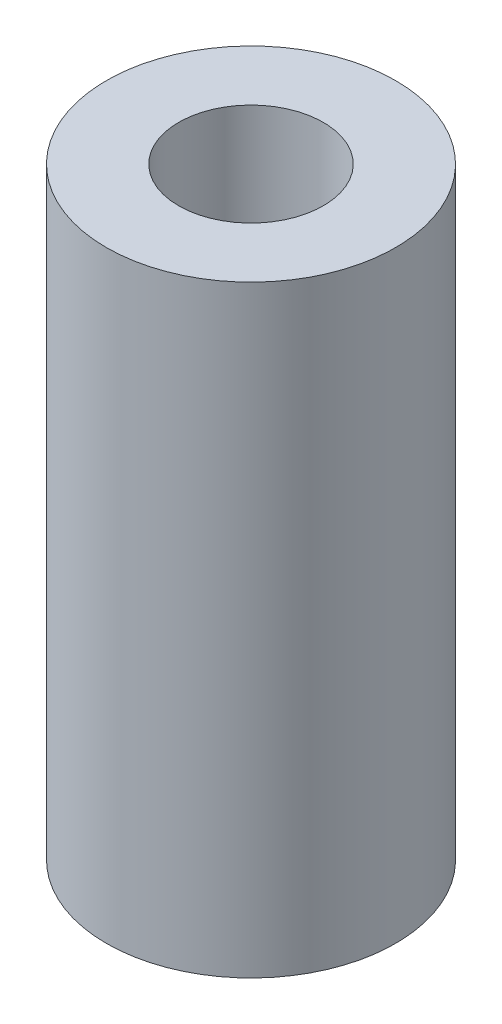
ISO-10303-21;
HEADER;
FILE_DESCRIPTION(('STEP AP214'),'2;1');
FILE_NAME('part.step','',(''),(''),'','','');
FILE_SCHEMA(('AUTOMOTIVE_DESIGN { 1 0 10303 214 1 1 1 1 }'));
ENDSEC;
DATA;
#1=APPLICATION_CONTEXT('core data for automotive mechanical design processes');
#2=APPLICATION_PROTOCOL_DEFINITION('international standard','automotive_design',2000,#1);
#3=PRODUCT_CONTEXT('',#1,'mechanical');
#4=PRODUCT('Part','Part','',(#3));
#5=PRODUCT_RELATED_PRODUCT_CATEGORY('part','',(#4));
#6=PRODUCT_DEFINITION_FORMATION('','',#4);
#7=PRODUCT_DEFINITION_CONTEXT('part definition',#1,'design');
#8=PRODUCT_DEFINITION('design','',#6,#7);
#9=PRODUCT_DEFINITION_SHAPE('','',#8);
#10=(LENGTH_UNIT() NAMED_UNIT(*) SI_UNIT(.MILLI.,.METRE.));
#11=(NAMED_UNIT(*) PLANE_ANGLE_UNIT() SI_UNIT($,.RADIAN.));
#12=(NAMED_UNIT(*) SI_UNIT($,.STERADIAN.) SOLID_ANGLE_UNIT());
#13=UNCERTAINTY_MEASURE_WITH_UNIT(LENGTH_MEASURE(1.E-05),#10,'distance_accuracy_value','');
#14=(GEOMETRIC_REPRESENTATION_CONTEXT(3) GLOBAL_UNCERTAINTY_ASSIGNED_CONTEXT((#13)) GLOBAL_UNIT_ASSIGNED_CONTEXT((#10,
#11,#12)) REPRESENTATION_CONTEXT('',''));
#15=CARTESIAN_POINT('',(0.,0.,0.));
#16=DIRECTION('',(0.,0.,1.));
#17=DIRECTION('',(1.,0.,0.));
#18=AXIS2_PLACEMENT_3D('',#15,#16,#17);
#19=CARTESIAN_POINT('',(0.,25.,0.));
#20=DIRECTION('',(0.,1.,0.));
#21=DIRECTION('',(0.,0.,1.));
#22=AXIS2_PLACEMENT_3D('',#19,#20,#21);
#23=PLANE('',#22);
#24=CARTESIAN_POINT('',(0.,25.,0.));
#25=DIRECTION('',(0.,1.,0.));
#26=DIRECTION('',(0.,0.,1.));
#27=AXIS2_PLACEMENT_3D('',#24,#25,#26);
#28=CIRCLE('',#27,6.);
#29=CARTESIAN_POINT('',(0.,25.,6.));
#30=VERTEX_POINT('',#29);
#31=EDGE_CURVE('E10',#30,#30,#28,.T.);
#32=ORIENTED_EDGE('',*,*,#31,.T.);
#33=EDGE_LOOP('',(#32));
#34=FACE_BOUND('',#33,.T.);
#35=CARTESIAN_POINT('',(0.,25.,0.));
#36=DIRECTION('',(0.,1.,0.));
#37=DIRECTION('',(0.,0.,1.));
#38=AXIS2_PLACEMENT_3D('',#35,#36,#37);
#39=CIRCLE('',#38,3.);
#40=CARTESIAN_POINT('',(0.,25.,3.));
#41=VERTEX_POINT('',#40);
#42=EDGE_CURVE('E52',#41,#41,#39,.T.);
#43=ORIENTED_EDGE('',*,*,#42,.F.);
#44=EDGE_LOOP('',(#43));
#45=FACE_BOUND('',#44,.T.);
#46=ADVANCED_FACE('F39',(#34,#45),#23,.T.);
#47=CARTESIAN_POINT('',(0.,0.,0.));
#48=DIRECTION('',(0.,1.,0.));
#49=DIRECTION('',(0.,0.,1.));
#50=AXIS2_PLACEMENT_3D('',#47,#48,#49);
#51=PLANE('',#50);
#52=CARTESIAN_POINT('',(0.,0.,0.));
#53=DIRECTION('',(0.,1.,0.));
#54=DIRECTION('',(0.,0.,1.));
#55=AXIS2_PLACEMENT_3D('',#52,#53,#54);
#56=CIRCLE('',#55,6.);
#57=CARTESIAN_POINT('',(0.,0.,6.));
#58=VERTEX_POINT('',#57);
#59=EDGE_CURVE('E43',#58,#58,#56,.T.);
#60=ORIENTED_EDGE('',*,*,#59,.F.);
#61=EDGE_LOOP('',(#60));
#62=FACE_BOUND('',#61,.T.);
#63=CARTESIAN_POINT('',(0.,0.,0.));
#64=DIRECTION('',(0.,1.,0.));
#65=DIRECTION('',(0.,0.,1.));
#66=AXIS2_PLACEMENT_3D('',#63,#64,#65);
#67=CIRCLE('',#66,3.);
#68=CARTESIAN_POINT('',(0.,0.,3.));
#69=VERTEX_POINT('',#68);
#70=EDGE_CURVE('E54',#69,#69,#67,.T.);
#71=ORIENTED_EDGE('',*,*,#70,.T.);
#72=EDGE_LOOP('',(#71));
#73=FACE_BOUND('',#72,.T.);
#74=ADVANCED_FACE('F66',(#62,#73),#51,.F.);
#75=CARTESIAN_POINT('',(0.,25.,0.));
#76=DIRECTION('',(0.,-1.,0.));
#77=DIRECTION('',(0.,0.,-1.));
#78=AXIS2_PLACEMENT_3D('',#75,#76,#77);
#79=CYLINDRICAL_SURFACE('',#78,6.);
#80=ORIENTED_EDGE('',*,*,#31,.F.);
#81=EDGE_LOOP('',(#80));
#82=FACE_BOUND('',#81,.T.);
#83=ORIENTED_EDGE('',*,*,#59,.T.);
#84=EDGE_LOOP('',(#83));
#85=FACE_BOUND('',#84,.T.);
#86=ADVANCED_FACE('F41',(#82,#85),#79,.T.);
#87=CARTESIAN_POINT('',(0.,25.,0.));
#88=DIRECTION('',(0.,-1.,0.));
#89=DIRECTION('',(0.,0.,-1.));
#90=AXIS2_PLACEMENT_3D('',#87,#88,#89);
#91=CYLINDRICAL_SURFACE('',#90,3.);
#92=ORIENTED_EDGE('',*,*,#42,.T.);
#93=EDGE_LOOP('',(#92));
#94=FACE_BOUND('',#93,.T.);
#95=ORIENTED_EDGE('',*,*,#70,.F.);
#96=EDGE_LOOP('',(#95));
#97=FACE_BOUND('',#96,.T.);
#98=ADVANCED_FACE('F62',(#94,#97),#91,.F.);
#99=CLOSED_SHELL('',(#46,#74,#86,#98));
#100=MANIFOLD_SOLID_BREP('B2',#99);
#101=ADVANCED_BREP_SHAPE_REPRESENTATION('',(#18,#100),#14);
#102=SHAPE_DEFINITION_REPRESENTATION(#9,#101);
ENDSEC;
END-ISO-10303-21;
